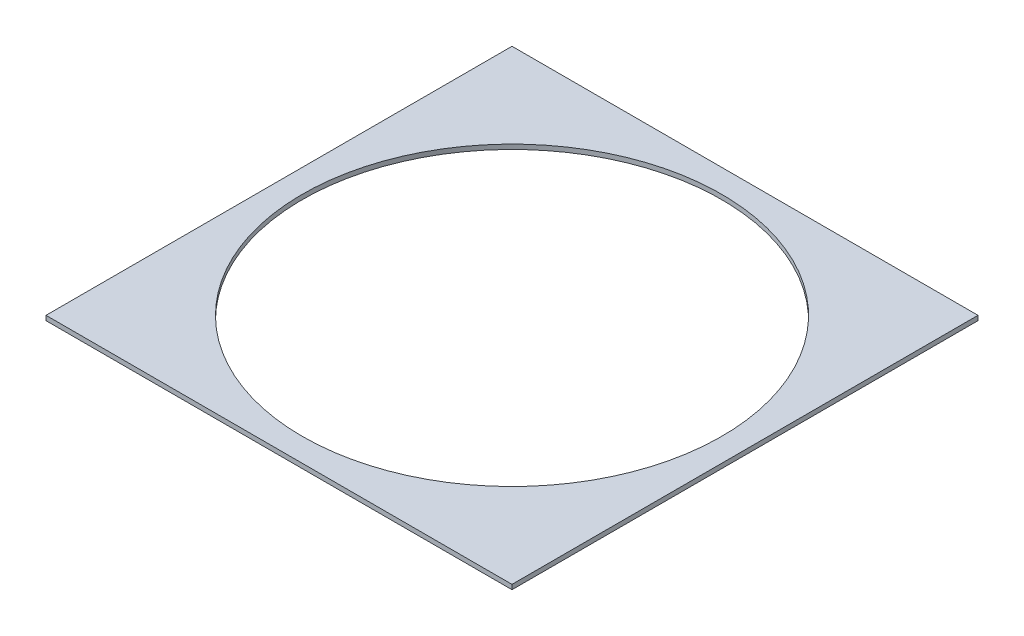
ISO-10303-21;
HEADER;
FILE_DESCRIPTION(('STEP AP214'),'2;1');
FILE_NAME('part.step','',(''),(''),'','','');
FILE_SCHEMA(('AUTOMOTIVE_DESIGN { 1 0 10303 214 1 1 1 1 }'));
ENDSEC;
DATA;
#1=APPLICATION_CONTEXT('core data for automotive mechanical design processes');
#2=APPLICATION_PROTOCOL_DEFINITION('international standard','automotive_design',2000,#1);
#3=PRODUCT_CONTEXT('',#1,'mechanical');
#4=PRODUCT('Part','Part','',(#3));
#5=PRODUCT_RELATED_PRODUCT_CATEGORY('part','',(#4));
#6=PRODUCT_DEFINITION_FORMATION('','',#4);
#7=PRODUCT_DEFINITION_CONTEXT('part definition',#1,'design');
#8=PRODUCT_DEFINITION('design','',#6,#7);
#9=PRODUCT_DEFINITION_SHAPE('','',#8);
#10=(LENGTH_UNIT() NAMED_UNIT(*) SI_UNIT(.MILLI.,.METRE.));
#11=(NAMED_UNIT(*) PLANE_ANGLE_UNIT() SI_UNIT($,.RADIAN.));
#12=(NAMED_UNIT(*) SI_UNIT($,.STERADIAN.) SOLID_ANGLE_UNIT());
#13=UNCERTAINTY_MEASURE_WITH_UNIT(LENGTH_MEASURE(1.E-05),#10,'distance_accuracy_value','');
#14=(GEOMETRIC_REPRESENTATION_CONTEXT(3) GLOBAL_UNCERTAINTY_ASSIGNED_CONTEXT((#13)) GLOBAL_UNIT_ASSIGNED_CONTEXT((#10,
#11,#12)) REPRESENTATION_CONTEXT('',''));
#15=CARTESIAN_POINT('',(0.,0.,0.));
#16=DIRECTION('',(0.,0.,1.));
#17=DIRECTION('',(1.,0.,0.));
#18=AXIS2_PLACEMENT_3D('',#15,#16,#17);
#19=CARTESIAN_POINT('',(63.5,1.27,63.5));
#20=DIRECTION('',(-1.,0.,0.));
#21=DIRECTION('',(0.,0.,1.));
#22=AXIS2_PLACEMENT_3D('',#19,#20,#21);
#23=PLANE('',#22);
#24=DIRECTION('',(0.,0.,-1.));
#25=VECTOR('',#24,1.);
#26=CARTESIAN_POINT('',(63.5,0.,63.5));
#27=LINE('',#26,#25);
#28=CARTESIAN_POINT('',(63.5,0.,63.5));
#29=VERTEX_POINT('',#28);
#30=CARTESIAN_POINT('',(63.5,0.,-63.5));
#31=VERTEX_POINT('',#30);
#32=EDGE_CURVE('E96',#29,#31,#27,.T.);
#33=ORIENTED_EDGE('',*,*,#32,.T.);
#34=DIRECTION('',(0.,-1.,0.));
#35=VECTOR('',#34,1.);
#36=CARTESIAN_POINT('',(63.5,1.27,-63.5));
#37=LINE('',#36,#35);
#38=CARTESIAN_POINT('',(63.5,1.27,-63.5));
#39=VERTEX_POINT('',#38);
#40=EDGE_CURVE('E11',#39,#31,#37,.T.);
#41=ORIENTED_EDGE('',*,*,#40,.F.);
#42=DIRECTION('',(0.,0.,-1.));
#43=VECTOR('',#42,1.);
#44=CARTESIAN_POINT('',(63.5,1.27,63.5));
#45=LINE('',#44,#43);
#46=CARTESIAN_POINT('',(63.5,1.27,63.5));
#47=VERTEX_POINT('',#46);
#48=EDGE_CURVE('E84',#47,#39,#45,.T.);
#49=ORIENTED_EDGE('',*,*,#48,.F.);
#50=DIRECTION('',(0.,-1.,0.));
#51=VECTOR('',#50,1.);
#52=CARTESIAN_POINT('',(63.5,1.27,63.5));
#53=LINE('',#52,#51);
#54=EDGE_CURVE('E92',#47,#29,#53,.T.);
#55=ORIENTED_EDGE('',*,*,#54,.T.);
#56=EDGE_LOOP('',(#33,#41,#49,#55));
#57=FACE_BOUND('',#56,.T.);
#58=ADVANCED_FACE('F33',(#57),#23,.F.);
#59=CARTESIAN_POINT('',(-63.5,1.27,-63.5));
#60=DIRECTION('',(0.,0.,1.));
#61=DIRECTION('',(1.,0.,0.));
#62=AXIS2_PLACEMENT_3D('',#59,#60,#61);
#63=PLANE('',#62);
#64=DIRECTION('',(-1.,0.,0.));
#65=VECTOR('',#64,1.);
#66=CARTESIAN_POINT('',(-63.5,0.,-63.5));
#67=LINE('',#66,#65);
#68=CARTESIAN_POINT('',(-63.5,0.,-63.5));
#69=VERTEX_POINT('',#68);
#70=EDGE_CURVE('E88',#31,#69,#67,.T.);
#71=ORIENTED_EDGE('',*,*,#70,.T.);
#72=DIRECTION('',(0.,-1.,0.));
#73=VECTOR('',#72,1.);
#74=CARTESIAN_POINT('',(-63.5,1.27,-63.5));
#75=LINE('',#74,#73);
#76=CARTESIAN_POINT('',(-63.5,1.27,-63.5));
#77=VERTEX_POINT('',#76);
#78=EDGE_CURVE('E41',#77,#69,#75,.T.);
#79=ORIENTED_EDGE('',*,*,#78,.F.);
#80=DIRECTION('',(-1.,0.,0.));
#81=VECTOR('',#80,1.);
#82=CARTESIAN_POINT('',(-63.5,1.27,-63.5));
#83=LINE('',#82,#81);
#84=EDGE_CURVE('E79',#39,#77,#83,.T.);
#85=ORIENTED_EDGE('',*,*,#84,.F.);
#86=ORIENTED_EDGE('',*,*,#40,.T.);
#87=EDGE_LOOP('',(#71,#79,#85,#86));
#88=FACE_BOUND('',#87,.T.);
#89=ADVANCED_FACE('F87',(#88),#63,.F.);
#90=CARTESIAN_POINT('',(-63.5,1.27,63.5));
#91=DIRECTION('',(1.,0.,0.));
#92=DIRECTION('',(0.,0.,-1.));
#93=AXIS2_PLACEMENT_3D('',#90,#91,#92);
#94=PLANE('',#93);
#95=DIRECTION('',(0.,0.,1.));
#96=VECTOR('',#95,1.);
#97=CARTESIAN_POINT('',(-63.5,0.,63.5));
#98=LINE('',#97,#96);
#99=CARTESIAN_POINT('',(-63.5,0.,63.5));
#100=VERTEX_POINT('',#99);
#101=EDGE_CURVE('E66',#69,#100,#98,.T.);
#102=ORIENTED_EDGE('',*,*,#101,.T.);
#103=DIRECTION('',(0.,-1.,0.));
#104=VECTOR('',#103,1.);
#105=CARTESIAN_POINT('',(-63.5,1.27,63.5));
#106=LINE('',#105,#104);
#107=CARTESIAN_POINT('',(-63.5,1.27,63.5));
#108=VERTEX_POINT('',#107);
#109=EDGE_CURVE('E89',#108,#100,#106,.T.);
#110=ORIENTED_EDGE('',*,*,#109,.F.);
#111=DIRECTION('',(0.,0.,1.));
#112=VECTOR('',#111,1.);
#113=CARTESIAN_POINT('',(-63.5,1.27,63.5));
#114=LINE('',#113,#112);
#115=EDGE_CURVE('E82',#77,#108,#114,.T.);
#116=ORIENTED_EDGE('',*,*,#115,.F.);
#117=ORIENTED_EDGE('',*,*,#78,.T.);
#118=EDGE_LOOP('',(#102,#110,#116,#117));
#119=FACE_BOUND('',#118,.T.);
#120=ADVANCED_FACE('F90',(#119),#94,.F.);
#121=CARTESIAN_POINT('',(-63.5,1.27,63.5));
#122=DIRECTION('',(0.,0.,-1.));
#123=DIRECTION('',(-1.,0.,0.));
#124=AXIS2_PLACEMENT_3D('',#121,#122,#123);
#125=PLANE('',#124);
#126=DIRECTION('',(1.,0.,0.));
#127=VECTOR('',#126,1.);
#128=CARTESIAN_POINT('',(-63.5,0.,63.5));
#129=LINE('',#128,#127);
#130=EDGE_CURVE('E72',#100,#29,#129,.T.);
#131=ORIENTED_EDGE('',*,*,#130,.T.);
#132=ORIENTED_EDGE('',*,*,#54,.F.);
#133=DIRECTION('',(1.,0.,0.));
#134=VECTOR('',#133,1.);
#135=CARTESIAN_POINT('',(-63.5,1.27,63.5));
#136=LINE('',#135,#134);
#137=EDGE_CURVE('E49',#108,#47,#136,.T.);
#138=ORIENTED_EDGE('',*,*,#137,.F.);
#139=ORIENTED_EDGE('',*,*,#109,.T.);
#140=EDGE_LOOP('',(#131,#132,#138,#139));
#141=FACE_BOUND('',#140,.T.);
#142=ADVANCED_FACE('F104',(#141),#125,.F.);
#143=CARTESIAN_POINT('',(63.5,1.27,-63.5));
#144=DIRECTION('',(0.,-1.,0.));
#145=DIRECTION('',(0.,0.,-1.));
#146=AXIS2_PLACEMENT_3D('',#143,#144,#145);
#147=PLANE('',#146);
#148=CARTESIAN_POINT('',(0.,1.27,0.));
#149=DIRECTION('',(0.,1.,0.));
#150=DIRECTION('',(0.,0.,1.));
#151=AXIS2_PLACEMENT_3D('',#148,#149,#150);
#152=CIRCLE('',#151,57.15);
#153=CARTESIAN_POINT('',(0.,1.27,57.15));
#154=VERTEX_POINT('',#153);
#155=EDGE_CURVE('E110',#154,#154,#152,.T.);
#156=ORIENTED_EDGE('',*,*,#155,.F.);
#157=EDGE_LOOP('',(#156));
#158=FACE_BOUND('',#157,.T.);
#159=ORIENTED_EDGE('',*,*,#48,.T.);
#160=ORIENTED_EDGE('',*,*,#84,.T.);
#161=ORIENTED_EDGE('',*,*,#115,.T.);
#162=ORIENTED_EDGE('',*,*,#137,.T.);
#163=EDGE_LOOP('',(#159,#160,#161,#162));
#164=FACE_BOUND('',#163,.T.);
#165=ADVANCED_FACE('F80',(#158,#164),#147,.F.);
#166=CARTESIAN_POINT('',(63.5,0.,-63.5));
#167=DIRECTION('',(0.,-1.,0.));
#168=DIRECTION('',(0.,0.,-1.));
#169=AXIS2_PLACEMENT_3D('',#166,#167,#168);
#170=PLANE('',#169);
#171=CARTESIAN_POINT('',(0.,0.,0.));
#172=DIRECTION('',(0.,1.,0.));
#173=DIRECTION('',(0.,0.,1.));
#174=AXIS2_PLACEMENT_3D('',#171,#172,#173);
#175=CIRCLE('',#174,57.15);
#176=CARTESIAN_POINT('',(0.,0.,57.15));
#177=VERTEX_POINT('',#176);
#178=EDGE_CURVE('E99',#177,#177,#175,.T.);
#179=ORIENTED_EDGE('',*,*,#178,.T.);
#180=EDGE_LOOP('',(#179));
#181=FACE_BOUND('',#180,.T.);
#182=ORIENTED_EDGE('',*,*,#32,.F.);
#183=ORIENTED_EDGE('',*,*,#130,.F.);
#184=ORIENTED_EDGE('',*,*,#101,.F.);
#185=ORIENTED_EDGE('',*,*,#70,.F.);
#186=EDGE_LOOP('',(#182,#183,#184,#185));
#187=FACE_BOUND('',#186,.T.);
#188=ADVANCED_FACE('F107',(#181,#187),#170,.T.);
#189=CARTESIAN_POINT('',(0.,0.,0.));
#190=DIRECTION('',(0.,1.,0.));
#191=DIRECTION('',(0.,0.,1.));
#192=AXIS2_PLACEMENT_3D('',#189,#190,#191);
#193=CYLINDRICAL_SURFACE('',#192,57.15);
#194=ORIENTED_EDGE('',*,*,#178,.F.);
#195=EDGE_LOOP('',(#194));
#196=FACE_BOUND('',#195,.T.);
#197=ORIENTED_EDGE('',*,*,#155,.T.);
#198=EDGE_LOOP('',(#197));
#199=FACE_BOUND('',#198,.T.);
#200=ADVANCED_FACE('F117',(#196,#199),#193,.F.);
#201=CLOSED_SHELL('',(#58,#89,#120,#142,#165,#188,#200));
#202=MANIFOLD_SOLID_BREP('B2',#201);
#203=ADVANCED_BREP_SHAPE_REPRESENTATION('',(#18,#202),#14);
#204=SHAPE_DEFINITION_REPRESENTATION(#9,#203);
ENDSEC;
END-ISO-10303-21;
